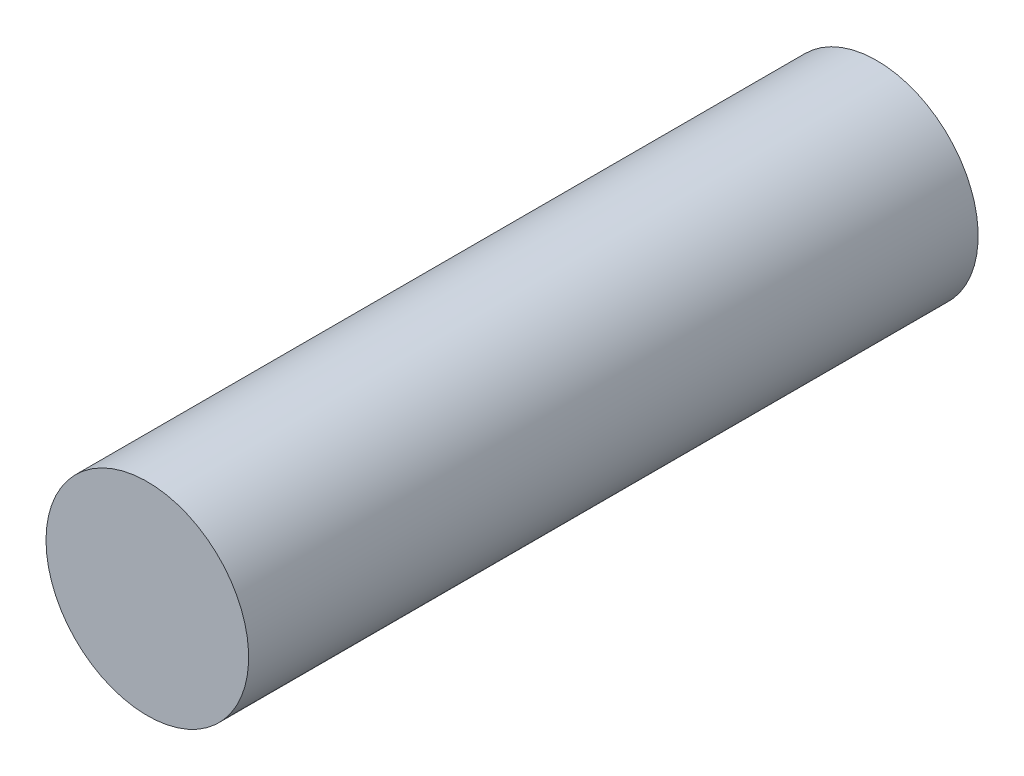
ISO-10303-21;
HEADER;
FILE_DESCRIPTION(('STEP AP214'),'2;1');
FILE_NAME('part.step','',(''),(''),'','','');
FILE_SCHEMA(('AUTOMOTIVE_DESIGN { 1 0 10303 214 1 1 1 1 }'));
ENDSEC;
DATA;
#1=APPLICATION_CONTEXT('core data for automotive mechanical design processes');
#2=APPLICATION_PROTOCOL_DEFINITION('international standard','automotive_design',2000,#1);
#3=PRODUCT_CONTEXT('',#1,'mechanical');
#4=PRODUCT('Part','Part','',(#3));
#5=PRODUCT_RELATED_PRODUCT_CATEGORY('part','',(#4));
#6=PRODUCT_DEFINITION_FORMATION('','',#4);
#7=PRODUCT_DEFINITION_CONTEXT('part definition',#1,'design');
#8=PRODUCT_DEFINITION('design','',#6,#7);
#9=PRODUCT_DEFINITION_SHAPE('','',#8);
#10=(LENGTH_UNIT() NAMED_UNIT(*) SI_UNIT(.MILLI.,.METRE.));
#11=(NAMED_UNIT(*) PLANE_ANGLE_UNIT() SI_UNIT($,.RADIAN.));
#12=(NAMED_UNIT(*) SI_UNIT($,.STERADIAN.) SOLID_ANGLE_UNIT());
#13=UNCERTAINTY_MEASURE_WITH_UNIT(LENGTH_MEASURE(1.E-05),#10,'distance_accuracy_value','');
#14=(GEOMETRIC_REPRESENTATION_CONTEXT(3) GLOBAL_UNCERTAINTY_ASSIGNED_CONTEXT((#13)) GLOBAL_UNIT_ASSIGNED_CONTEXT((#10,
#11,#12)) REPRESENTATION_CONTEXT('',''));
#15=CARTESIAN_POINT('',(0.,0.,0.));
#16=DIRECTION('',(0.,0.,1.));
#17=DIRECTION('',(1.,0.,0.));
#18=AXIS2_PLACEMENT_3D('',#15,#16,#17);
#19=CARTESIAN_POINT('',(0.,0.,90.));
#20=DIRECTION('',(0.,0.,-1.));
#21=DIRECTION('',(-1.,0.,0.));
#22=AXIS2_PLACEMENT_3D('',#19,#20,#21);
#23=CYLINDRICAL_SURFACE('',#22,12.5);
#24=CARTESIAN_POINT('',(0.,0.,90.));
#25=DIRECTION('',(0.,0.,1.));
#26=DIRECTION('',(1.,0.,0.));
#27=AXIS2_PLACEMENT_3D('',#24,#25,#26);
#28=CIRCLE('',#27,12.5);
#29=CARTESIAN_POINT('',(-12.5,0.,90.));
#30=VERTEX_POINT('',#29);
#31=EDGE_CURVE('E10',#30,#30,#28,.T.);
#32=CARTESIAN_POINT('',(0.,0.,0.));
#33=DIRECTION('',(0.,0.,1.));
#34=DIRECTION('',(1.,0.,0.));
#35=AXIS2_PLACEMENT_3D('',#32,#33,#34);
#36=CIRCLE('',#35,12.5);
#37=CARTESIAN_POINT('',(-12.5,0.,0.));
#38=VERTEX_POINT('',#37);
#39=EDGE_CURVE('E35',#38,#38,#36,.T.);
#40=CARTESIAN_POINT('',(-12.5,0.,90.));
#41=CARTESIAN_POINT('',(-12.5,0.,89.0625));
#42=CARTESIAN_POINT('',(-12.5,0.,88.125));
#43=CARTESIAN_POINT('',(-12.5,0.,86.25));
#44=CARTESIAN_POINT('',(-12.5,0.,85.3125));
#45=CARTESIAN_POINT('',(-12.5,0.,83.4375));
#46=CARTESIAN_POINT('',(-12.5,0.,82.5));
#47=CARTESIAN_POINT('',(-12.5,0.,80.625));
#48=CARTESIAN_POINT('',(-12.5,0.,79.6875));
#49=CARTESIAN_POINT('',(-12.5,0.,77.8125));
#50=CARTESIAN_POINT('',(-12.5,0.,76.875));
#51=CARTESIAN_POINT('',(-12.5,0.,75.));
#52=CARTESIAN_POINT('',(-12.5,0.,74.0625));
#53=CARTESIAN_POINT('',(-12.5,0.,72.1875));
#54=CARTESIAN_POINT('',(-12.5,0.,71.25));
#55=CARTESIAN_POINT('',(-12.5,0.,69.375));
#56=CARTESIAN_POINT('',(-12.5,0.,68.4375));
#57=CARTESIAN_POINT('',(-12.5,0.,66.5625));
#58=CARTESIAN_POINT('',(-12.5,0.,65.625));
#59=CARTESIAN_POINT('',(-12.5,0.,63.75));
#60=CARTESIAN_POINT('',(-12.5,0.,62.8125));
#61=CARTESIAN_POINT('',(-12.5,0.,60.9375));
#62=CARTESIAN_POINT('',(-12.5,0.,60.));
#63=CARTESIAN_POINT('',(-12.5,0.,58.125));
#64=CARTESIAN_POINT('',(-12.5,0.,57.1875));
#65=CARTESIAN_POINT('',(-12.5,0.,55.3125));
#66=CARTESIAN_POINT('',(-12.5,0.,54.375));
#67=CARTESIAN_POINT('',(-12.5,0.,52.5));
#68=CARTESIAN_POINT('',(-12.5,0.,51.5625));
#69=CARTESIAN_POINT('',(-12.5,0.,49.6875));
#70=CARTESIAN_POINT('',(-12.5,0.,48.75));
#71=CARTESIAN_POINT('',(-12.5,0.,46.875));
#72=CARTESIAN_POINT('',(-12.5,0.,45.9375));
#73=CARTESIAN_POINT('',(-12.5,0.,44.0625));
#74=CARTESIAN_POINT('',(-12.5,0.,43.125));
#75=CARTESIAN_POINT('',(-12.5,0.,41.25));
#76=CARTESIAN_POINT('',(-12.5,0.,40.3125));
#77=CARTESIAN_POINT('',(-12.5,0.,38.4375));
#78=CARTESIAN_POINT('',(-12.5,0.,37.5));
#79=CARTESIAN_POINT('',(-12.5,0.,35.625));
#80=CARTESIAN_POINT('',(-12.5,0.,34.6875));
#81=CARTESIAN_POINT('',(-12.5,0.,32.8125));
#82=CARTESIAN_POINT('',(-12.5,0.,31.875));
#83=CARTESIAN_POINT('',(-12.5,0.,30.));
#84=CARTESIAN_POINT('',(-12.5,0.,29.0625));
#85=CARTESIAN_POINT('',(-12.5,0.,27.1875));
#86=CARTESIAN_POINT('',(-12.5,0.,26.25));
#87=CARTESIAN_POINT('',(-12.5,0.,24.375));
#88=CARTESIAN_POINT('',(-12.5,0.,23.4375));
#89=CARTESIAN_POINT('',(-12.5,0.,21.5625));
#90=CARTESIAN_POINT('',(-12.5,0.,20.625));
#91=CARTESIAN_POINT('',(-12.5,0.,18.75));
#92=CARTESIAN_POINT('',(-12.5,0.,17.8125));
#93=CARTESIAN_POINT('',(-12.5,0.,15.9375));
#94=CARTESIAN_POINT('',(-12.5,0.,15.));
#95=CARTESIAN_POINT('',(-12.5,0.,13.125));
#96=CARTESIAN_POINT('',(-12.5,0.,12.1875));
#97=CARTESIAN_POINT('',(-12.5,0.,10.3125));
#98=CARTESIAN_POINT('',(-12.5,0.,9.37499999999999));
#99=CARTESIAN_POINT('',(-12.5,0.,7.49999999999999));
#100=CARTESIAN_POINT('',(-12.5,0.,6.56249999999999));
#101=CARTESIAN_POINT('',(-12.5,0.,4.68749999999999));
#102=CARTESIAN_POINT('',(-12.5,0.,3.74999999999998));
#103=CARTESIAN_POINT('',(-12.5,0.,1.87499999999998));
#104=CARTESIAN_POINT('',(-12.5,0.,0.937499999999986));
#105=CARTESIAN_POINT('',(-12.5,0.,0.));
#106=B_SPLINE_CURVE_WITH_KNOTS('',3,(#40,#41,#42,#43,#44,#45,#46,#47,#48,#49,#50,#51,#52,#53,
#54,#55,#56,#57,#58,#59,#60,#61,#62,#63,#64,#65,#66,#67,#68,#69,#70,#71,#72,#73,#74,#75,#76,#77,
#78,#79,#80,#81,#82,#83,#84,#85,#86,#87,#88,#89,#90,#91,#92,#93,#94,#95,#96,#97,#98,#99,#100,
#101,#102,#103,#104,#105),.UNSPECIFIED.,.F.,.F.,(4,2,2,2,2,2,2,2,2,2,2,2,2,2,2,2,2,2,2,2,2,2,2,
2,2,2,2,2,2,2,2,2,4),(0.,2.81250000000001,5.62500000000001,8.43750000000001,11.25,14.0625,
16.875,19.6875,22.5,25.3125,28.125,30.9375,33.75,36.5625,39.375,42.1875,45.,47.8125,50.625,
53.4375,56.25,59.0625,61.875,64.6875,67.5,70.3125,73.125,75.9375,78.75,81.5625,84.375,87.1875,
90.),.UNSPECIFIED.);
#107=EDGE_CURVE('BSEAM32',#30,#38,#106,.T.);
#108=ORIENTED_EDGE('',*,*,#31,.F.);
#109=ORIENTED_EDGE('',*,*,#39,.T.);
#110=ORIENTED_EDGE('',*,*,#107,.T.);
#111=ORIENTED_EDGE('',*,*,#107,.F.);
#112=EDGE_LOOP('',(#108,#110,#109,#111));
#113=FACE_BOUND('',#112,.T.);
#114=ADVANCED_FACE('F32',(#113),#23,.T.);
#115=CARTESIAN_POINT('',(0.,0.,90.));
#116=DIRECTION('',(0.,0.,1.));
#117=DIRECTION('',(1.,0.,0.));
#118=AXIS2_PLACEMENT_3D('',#115,#116,#117);
#119=PLANE('',#118);
#120=ORIENTED_EDGE('',*,*,#31,.T.);
#121=EDGE_LOOP('',(#120));
#122=FACE_BOUND('',#121,.T.);
#123=ADVANCED_FACE('F47',(#122),#119,.T.);
#124=CARTESIAN_POINT('',(0.,0.,0.));
#125=DIRECTION('',(0.,0.,1.));
#126=DIRECTION('',(1.,0.,0.));
#127=AXIS2_PLACEMENT_3D('',#124,#125,#126);
#128=PLANE('',#127);
#129=ORIENTED_EDGE('',*,*,#39,.F.);
#130=EDGE_LOOP('',(#129));
#131=FACE_BOUND('',#130,.T.);
#132=ADVANCED_FACE('F45',(#131),#128,.F.);
#133=CLOSED_SHELL('',(#114,#123,#132));
#134=MANIFOLD_SOLID_BREP('B2',#133);
#135=ADVANCED_BREP_SHAPE_REPRESENTATION('',(#18,#134),#14);
#136=SHAPE_DEFINITION_REPRESENTATION(#9,#135);
ENDSEC;
END-ISO-10303-21;
